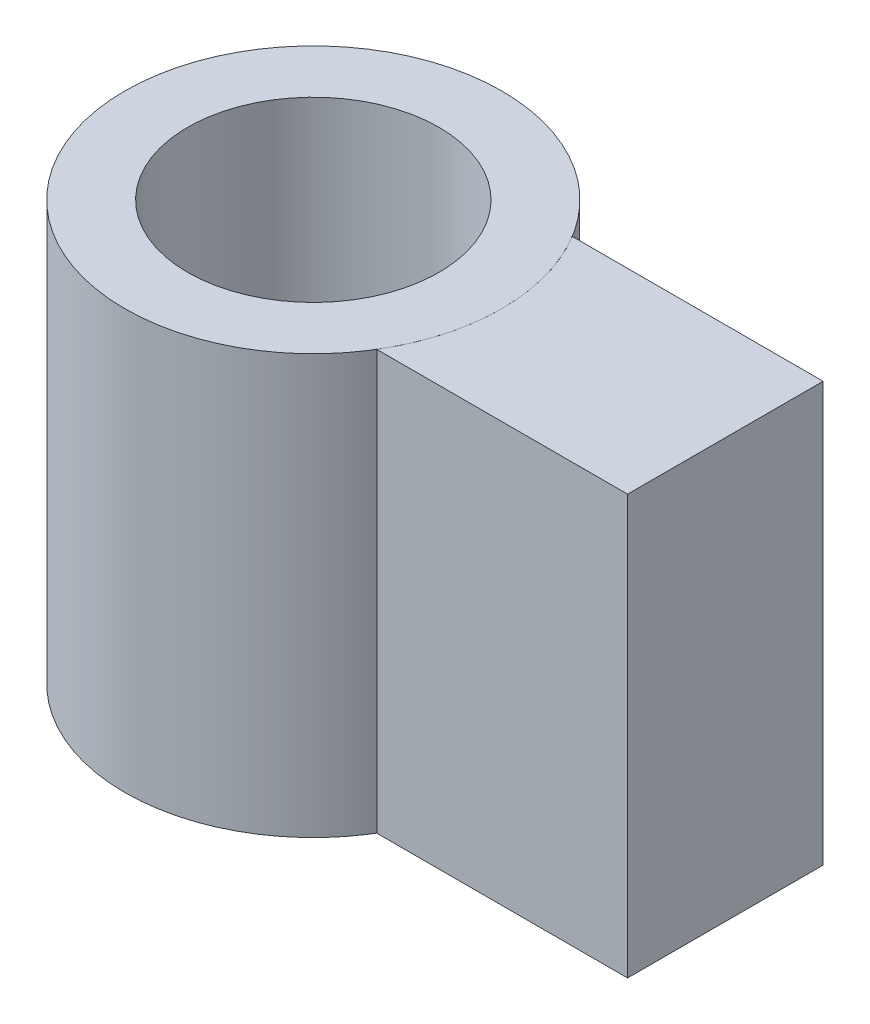
ISO-10303-21;
HEADER;
FILE_DESCRIPTION(('STEP AP214'),'2;1');
FILE_NAME('part.step','',(''),(''),'','','');
FILE_SCHEMA(('AUTOMOTIVE_DESIGN { 1 0 10303 214 1 1 1 1 }'));
ENDSEC;
DATA;
#1=APPLICATION_CONTEXT('core data for automotive mechanical design processes');
#2=APPLICATION_PROTOCOL_DEFINITION('international standard','automotive_design',2000,#1);
#3=PRODUCT_CONTEXT('',#1,'mechanical');
#4=PRODUCT('Part','Part','',(#3));
#5=PRODUCT_RELATED_PRODUCT_CATEGORY('part','',(#4));
#6=PRODUCT_DEFINITION_FORMATION('','',#4);
#7=PRODUCT_DEFINITION_CONTEXT('part definition',#1,'design');
#8=PRODUCT_DEFINITION('design','',#6,#7);
#9=PRODUCT_DEFINITION_SHAPE('','',#8);
#10=(LENGTH_UNIT() NAMED_UNIT(*) SI_UNIT(.MILLI.,.METRE.));
#11=(NAMED_UNIT(*) PLANE_ANGLE_UNIT() SI_UNIT($,.RADIAN.));
#12=(NAMED_UNIT(*) SI_UNIT($,.STERADIAN.) SOLID_ANGLE_UNIT());
#13=UNCERTAINTY_MEASURE_WITH_UNIT(LENGTH_MEASURE(1.E-05),#10,'distance_accuracy_value','');
#14=(GEOMETRIC_REPRESENTATION_CONTEXT(3) GLOBAL_UNCERTAINTY_ASSIGNED_CONTEXT((#13)) GLOBAL_UNIT_ASSIGNED_CONTEXT((#10,
#11,#12)) REPRESENTATION_CONTEXT('',''));
#15=CARTESIAN_POINT('',(0.,0.,0.));
#16=DIRECTION('',(0.,0.,1.));
#17=DIRECTION('',(1.,0.,0.));
#18=AXIS2_PLACEMENT_3D('',#15,#16,#17);
#19=CARTESIAN_POINT('',(-13.501,0.,6.99999999999967));
#20=DIRECTION('',(0.,1.,0.));
#21=DIRECTION('',(0.,0.,1.));
#22=AXIS2_PLACEMENT_3D('',#19,#20,#21);
#23=PLANE('',#22);
#24=CARTESIAN_POINT('',(0.,0.,0.));
#25=DIRECTION('',(0.,1.,0.));
#26=DIRECTION('',(0.,0.,1.));
#27=AXIS2_PLACEMENT_3D('',#24,#25,#26);
#28=CIRCLE('',#27,13.5);
#29=CARTESIAN_POINT('',(11.5433963806154,0.,6.99999999999967));
#30=VERTEX_POINT('',#29);
#31=CARTESIAN_POINT('',(11.5433963806152,0.,-7.));
#32=VERTEX_POINT('',#31);
#33=EDGE_CURVE('E12',#30,#32,#28,.T.);
#34=ORIENTED_EDGE('',*,*,#33,.F.);
#35=DIRECTION('',(1.,0.,0.));
#36=VECTOR('',#35,1.);
#37=CARTESIAN_POINT('',(-13.501,0.,6.99999999999967));
#38=LINE('',#37,#36);
#39=CARTESIAN_POINT('',(29.5,0.,6.99999999999967));
#40=VERTEX_POINT('',#39);
#41=EDGE_CURVE('E119',#30,#40,#38,.T.);
#42=ORIENTED_EDGE('',*,*,#41,.T.);
#43=DIRECTION('',(0.,0.,1.));
#44=VECTOR('',#43,1.);
#45=CARTESIAN_POINT('',(29.5,0.,6.99999999999967));
#46=LINE('',#45,#44);
#47=CARTESIAN_POINT('',(29.5,0.,-7.));
#48=VERTEX_POINT('',#47);
#49=EDGE_CURVE('E111',#48,#40,#46,.T.);
#50=ORIENTED_EDGE('',*,*,#49,.F.);
#51=DIRECTION('',(1.,0.,0.));
#52=VECTOR('',#51,1.);
#53=CARTESIAN_POINT('',(-13.501,0.,-7.));
#54=LINE('',#53,#52);
#55=EDGE_CURVE('E98',#32,#48,#54,.T.);
#56=ORIENTED_EDGE('',*,*,#55,.F.);
#57=EDGE_LOOP('',(#34,#42,#50,#56));
#58=FACE_BOUND('',#57,.T.);
#59=ADVANCED_FACE('F53',(#58),#23,.T.);
#60=CARTESIAN_POINT('',(-13.501,-30.,6.99999999999967));
#61=DIRECTION('',(0.,-1.,0.));
#62=DIRECTION('',(0.,0.,-1.));
#63=AXIS2_PLACEMENT_3D('',#60,#61,#62);
#64=PLANE('',#63);
#65=CARTESIAN_POINT('',(0.,-30.,0.));
#66=DIRECTION('',(0.,-1.,0.));
#67=DIRECTION('',(0.,0.,-1.));
#68=AXIS2_PLACEMENT_3D('',#65,#66,#67);
#69=CIRCLE('',#68,13.5);
#70=CARTESIAN_POINT('',(11.5433963806152,-30.,-7.));
#71=VERTEX_POINT('',#70);
#72=CARTESIAN_POINT('',(11.5433963806154,-30.,6.99999999999967));
#73=VERTEX_POINT('',#72);
#74=EDGE_CURVE('E116',#71,#73,#69,.T.);
#75=ORIENTED_EDGE('',*,*,#74,.F.);
#76=DIRECTION('',(1.,0.,0.));
#77=VECTOR('',#76,1.);
#78=CARTESIAN_POINT('',(-13.501,-30.,-7.));
#79=LINE('',#78,#77);
#80=CARTESIAN_POINT('',(29.5,-30.,-7.));
#81=VERTEX_POINT('',#80);
#82=EDGE_CURVE('E99',#71,#81,#79,.T.);
#83=ORIENTED_EDGE('',*,*,#82,.T.);
#84=DIRECTION('',(0.,0.,-1.));
#85=VECTOR('',#84,1.);
#86=CARTESIAN_POINT('',(29.5,-30.,6.99999999999967));
#87=LINE('',#86,#85);
#88=CARTESIAN_POINT('',(29.5,-30.,6.99999999999967));
#89=VERTEX_POINT('',#88);
#90=EDGE_CURVE('E101',#89,#81,#87,.T.);
#91=ORIENTED_EDGE('',*,*,#90,.F.);
#92=DIRECTION('',(1.,0.,0.));
#93=VECTOR('',#92,1.);
#94=CARTESIAN_POINT('',(-13.501,-30.,6.99999999999967));
#95=LINE('',#94,#93);
#96=EDGE_CURVE('E57',#73,#89,#95,.T.);
#97=ORIENTED_EDGE('',*,*,#96,.F.);
#98=EDGE_LOOP('',(#75,#83,#91,#97));
#99=FACE_BOUND('',#98,.T.);
#100=ADVANCED_FACE('F102',(#99),#64,.T.);
#101=CARTESIAN_POINT('',(-13.501,0.,6.99999999999967));
#102=DIRECTION('',(0.,0.,1.));
#103=DIRECTION('',(1.,0.,0.));
#104=AXIS2_PLACEMENT_3D('',#101,#102,#103);
#105=PLANE('',#104);
#106=DIRECTION('',(0.,1.,0.));
#107=VECTOR('',#106,1.);
#108=CARTESIAN_POINT('',(11.5433963806154,-30.,6.99999999999967));
#109=LINE('',#108,#107);
#110=EDGE_CURVE('E63',#73,#30,#109,.T.);
#111=ORIENTED_EDGE('',*,*,#110,.F.);
#112=ORIENTED_EDGE('',*,*,#96,.T.);
#113=DIRECTION('',(0.,-1.,0.));
#114=VECTOR('',#113,1.);
#115=CARTESIAN_POINT('',(29.5,0.,6.99999999999967));
#116=LINE('',#115,#114);
#117=EDGE_CURVE('E94',#40,#89,#116,.T.);
#118=ORIENTED_EDGE('',*,*,#117,.F.);
#119=ORIENTED_EDGE('',*,*,#41,.F.);
#120=EDGE_LOOP('',(#111,#112,#118,#119));
#121=FACE_BOUND('',#120,.T.);
#122=ADVANCED_FACE('F91',(#121),#105,.T.);
#123=CARTESIAN_POINT('',(-13.501,0.,-7.));
#124=DIRECTION('',(0.,0.,-1.));
#125=DIRECTION('',(0.,1.,0.));
#126=AXIS2_PLACEMENT_3D('',#123,#124,#125);
#127=PLANE('',#126);
#128=DIRECTION('',(0.,1.,0.));
#129=VECTOR('',#128,1.);
#130=CARTESIAN_POINT('',(11.5433963806152,-30.,-7.));
#131=LINE('',#130,#129);
#132=EDGE_CURVE('E118',#32,#71,#131,.F.);
#133=ORIENTED_EDGE('',*,*,#132,.F.);
#134=ORIENTED_EDGE('',*,*,#55,.T.);
#135=DIRECTION('',(0.,1.,0.));
#136=VECTOR('',#135,1.);
#137=CARTESIAN_POINT('',(29.5,0.,-7.));
#138=LINE('',#137,#136);
#139=EDGE_CURVE('E107',#81,#48,#138,.T.);
#140=ORIENTED_EDGE('',*,*,#139,.F.);
#141=ORIENTED_EDGE('',*,*,#82,.F.);
#142=EDGE_LOOP('',(#133,#134,#140,#141));
#143=FACE_BOUND('',#142,.T.);
#144=ADVANCED_FACE('F127',(#143),#127,.T.);
#145=CARTESIAN_POINT('',(29.5,0.,0.));
#146=DIRECTION('',(-1.,0.,0.));
#147=DIRECTION('',(0.,0.,1.));
#148=AXIS2_PLACEMENT_3D('',#145,#146,#147);
#149=PLANE('',#148);
#150=ORIENTED_EDGE('',*,*,#49,.T.);
#151=ORIENTED_EDGE('',*,*,#117,.T.);
#152=ORIENTED_EDGE('',*,*,#90,.T.);
#153=ORIENTED_EDGE('',*,*,#139,.T.);
#154=EDGE_LOOP('',(#150,#151,#152,#153));
#155=FACE_BOUND('',#154,.T.);
#156=ADVANCED_FACE('F109',(#155),#149,.F.);
#157=CARTESIAN_POINT('',(0.,-30.,0.));
#158=DIRECTION('',(0.,1.,0.));
#159=DIRECTION('',(0.,0.,1.));
#160=AXIS2_PLACEMENT_3D('',#157,#158,#159);
#161=CYLINDRICAL_SURFACE('',#160,13.5);
#162=ORIENTED_EDGE('',*,*,#132,.T.);
#163=ORIENTED_EDGE('',*,*,#74,.T.);
#164=ORIENTED_EDGE('',*,*,#110,.T.);
#165=ORIENTED_EDGE('',*,*,#33,.T.);
#166=EDGE_LOOP('',(#162,#163,#164,#165));
#167=FACE_BOUND('',#166,.T.);
#168=ADVANCED_FACE('F55',(#167),#161,.F.);
#169=CLOSED_SHELL('',(#59,#100,#122,#144,#156,#168));
#170=MANIFOLD_SOLID_BREP('B2',#169);
#171=CARTESIAN_POINT('',(0.,-30.,0.));
#172=DIRECTION('',(0.,1.,0.));
#173=DIRECTION('',(0.,0.,1.));
#174=AXIS2_PLACEMENT_3D('',#171,#172,#173);
#175=CYLINDRICAL_SURFACE('',#174,13.5);
#176=CARTESIAN_POINT('',(0.,-30.,0.));
#177=DIRECTION('',(0.,1.,0.));
#178=DIRECTION('',(0.,0.,1.));
#179=AXIS2_PLACEMENT_3D('',#176,#177,#178);
#180=CIRCLE('',#179,13.5);
#181=CARTESIAN_POINT('',(0.,-30.,13.5));
#182=VERTEX_POINT('',#181);
#183=EDGE_CURVE('E52',#182,#182,#180,.T.);
#184=ORIENTED_EDGE('',*,*,#183,.T.);
#185=EDGE_LOOP('',(#184));
#186=FACE_BOUND('',#185,.T.);
#187=CARTESIAN_POINT('',(0.,0.,0.));
#188=DIRECTION('',(0.,1.,0.));
#189=DIRECTION('',(0.,0.,1.));
#190=AXIS2_PLACEMENT_3D('',#187,#188,#189);
#191=CIRCLE('',#190,13.5);
#192=CARTESIAN_POINT('',(0.,0.,13.5));
#193=VERTEX_POINT('',#192);
#194=EDGE_CURVE('E180',#193,#193,#191,.T.);
#195=ORIENTED_EDGE('',*,*,#194,.F.);
#196=EDGE_LOOP('',(#195));
#197=FACE_BOUND('',#196,.T.);
#198=ADVANCED_FACE('F177',(#186,#197),#175,.T.);
#199=CARTESIAN_POINT('',(0.,-30.,0.));
#200=DIRECTION('',(0.,1.,0.));
#201=DIRECTION('',(0.,0.,1.));
#202=AXIS2_PLACEMENT_3D('',#199,#200,#201);
#203=PLANE('',#202);
#204=CARTESIAN_POINT('',(0.,-30.,0.));
#205=DIRECTION('',(0.,1.,0.));
#206=DIRECTION('',(0.,0.,1.));
#207=AXIS2_PLACEMENT_3D('',#204,#205,#206);
#208=CIRCLE('',#207,9.);
#209=CARTESIAN_POINT('',(0.,-30.,9.));
#210=VERTEX_POINT('',#209);
#211=EDGE_CURVE('E189',#210,#210,#208,.T.);
#212=ORIENTED_EDGE('',*,*,#211,.T.);
#213=EDGE_LOOP('',(#212));
#214=FACE_BOUND('',#213,.T.);
#215=ORIENTED_EDGE('',*,*,#183,.F.);
#216=EDGE_LOOP('',(#215));
#217=FACE_BOUND('',#216,.T.);
#218=ADVANCED_FACE('F199',(#214,#217),#203,.F.);
#219=CARTESIAN_POINT('',(0.,0.,0.));
#220=DIRECTION('',(0.,1.,0.));
#221=DIRECTION('',(0.,0.,1.));
#222=AXIS2_PLACEMENT_3D('',#219,#220,#221);
#223=PLANE('',#222);
#224=CARTESIAN_POINT('',(0.,0.,0.));
#225=DIRECTION('',(0.,1.,0.));
#226=DIRECTION('',(0.,0.,1.));
#227=AXIS2_PLACEMENT_3D('',#224,#225,#226);
#228=CIRCLE('',#227,9.);
#229=CARTESIAN_POINT('',(0.,0.,9.));
#230=VERTEX_POINT('',#229);
#231=EDGE_CURVE('E191',#230,#230,#228,.T.);
#232=ORIENTED_EDGE('',*,*,#231,.F.);
#233=EDGE_LOOP('',(#232));
#234=FACE_BOUND('',#233,.T.);
#235=ORIENTED_EDGE('',*,*,#194,.T.);
#236=EDGE_LOOP('',(#235));
#237=FACE_BOUND('',#236,.T.);
#238=ADVANCED_FACE('F205',(#234,#237),#223,.T.);
#239=CARTESIAN_POINT('',(0.,-30.,0.));
#240=DIRECTION('',(0.,1.,0.));
#241=DIRECTION('',(0.,0.,1.));
#242=AXIS2_PLACEMENT_3D('',#239,#240,#241);
#243=CYLINDRICAL_SURFACE('',#242,9.);
#244=ORIENTED_EDGE('',*,*,#211,.F.);
#245=EDGE_LOOP('',(#244));
#246=FACE_BOUND('',#245,.T.);
#247=ORIENTED_EDGE('',*,*,#231,.T.);
#248=EDGE_LOOP('',(#247));
#249=FACE_BOUND('',#248,.T.);
#250=ADVANCED_FACE('F202',(#246,#249),#243,.F.);
#251=CLOSED_SHELL('',(#198,#218,#238,#250));
#252=MANIFOLD_SOLID_BREP('B6',#251);
#253=ADVANCED_BREP_SHAPE_REPRESENTATION('',(#18,#170,#252),#14);
#254=SHAPE_DEFINITION_REPRESENTATION(#9,#253);
ENDSEC;
END-ISO-10303-21;
